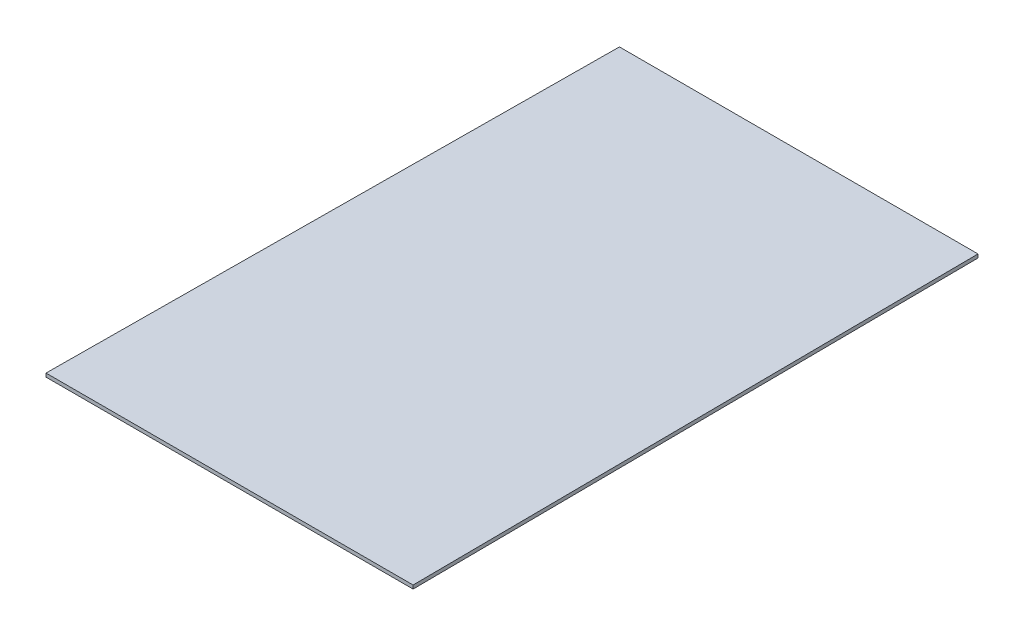
ISO-10303-21;
HEADER;
FILE_DESCRIPTION(('STEP AP214'),'2;1');
FILE_NAME('part.step','',(''),(''),'','','');
FILE_SCHEMA(('AUTOMOTIVE_DESIGN { 1 0 10303 214 1 1 1 1 }'));
ENDSEC;
DATA;
#1=APPLICATION_CONTEXT('core data for automotive mechanical design processes');
#2=APPLICATION_PROTOCOL_DEFINITION('international standard','automotive_design',2000,#1);
#3=PRODUCT_CONTEXT('',#1,'mechanical');
#4=PRODUCT('Part','Part','',(#3));
#5=PRODUCT_RELATED_PRODUCT_CATEGORY('part','',(#4));
#6=PRODUCT_DEFINITION_FORMATION('','',#4);
#7=PRODUCT_DEFINITION_CONTEXT('part definition',#1,'design');
#8=PRODUCT_DEFINITION('design','',#6,#7);
#9=PRODUCT_DEFINITION_SHAPE('','',#8);
#10=(LENGTH_UNIT() NAMED_UNIT(*) SI_UNIT(.MILLI.,.METRE.));
#11=(NAMED_UNIT(*) PLANE_ANGLE_UNIT() SI_UNIT($,.RADIAN.));
#12=(NAMED_UNIT(*) SI_UNIT($,.STERADIAN.) SOLID_ANGLE_UNIT());
#13=UNCERTAINTY_MEASURE_WITH_UNIT(LENGTH_MEASURE(1.E-05),#10,'distance_accuracy_value','');
#14=(GEOMETRIC_REPRESENTATION_CONTEXT(3) GLOBAL_UNCERTAINTY_ASSIGNED_CONTEXT((#13)) GLOBAL_UNIT_ASSIGNED_CONTEXT((#10,
#11,#12)) REPRESENTATION_CONTEXT('',''));
#15=CARTESIAN_POINT('',(0.,0.,0.));
#16=DIRECTION('',(0.,0.,1.));
#17=DIRECTION('',(1.,0.,0.));
#18=AXIS2_PLACEMENT_3D('',#15,#16,#17);
#19=CARTESIAN_POINT('',(-160.02,3.175,-508.));
#20=DIRECTION('',(0.999971876186468,0.,0.00749978907139852));
#21=DIRECTION('',(0.00749978907139852,0.,-0.999971876186468));
#22=AXIS2_PLACEMENT_3D('',#19,#20,#21);
#23=PLANE('',#22);
#24=DIRECTION('',(-0.00749978907139852,0.,0.999971876186468));
#25=VECTOR('',#24,1.);
#26=CARTESIAN_POINT('',(-160.02,0.,-508.));
#27=LINE('',#26,#25);
#28=CARTESIAN_POINT('',(-160.02,0.,-508.));
#29=VERTEX_POINT('',#28);
#30=CARTESIAN_POINT('',(-163.83,0.,0.));
#31=VERTEX_POINT('',#30);
#32=EDGE_CURVE('E102',#29,#31,#27,.T.);
#33=ORIENTED_EDGE('',*,*,#32,.T.);
#34=DIRECTION('',(0.,-1.,0.));
#35=VECTOR('',#34,1.);
#36=CARTESIAN_POINT('',(-163.83,3.175,0.));
#37=LINE('',#36,#35);
#38=CARTESIAN_POINT('',(-163.83,3.175,0.));
#39=VERTEX_POINT('',#38);
#40=EDGE_CURVE('E11',#39,#31,#37,.T.);
#41=ORIENTED_EDGE('',*,*,#40,.F.);
#42=DIRECTION('',(-0.00749978907139852,0.,0.999971876186468));
#43=VECTOR('',#42,1.);
#44=CARTESIAN_POINT('',(-160.02,3.175,-508.));
#45=LINE('',#44,#43);
#46=CARTESIAN_POINT('',(-160.02,3.175,-508.));
#47=VERTEX_POINT('',#46);
#48=EDGE_CURVE('E90',#47,#39,#45,.T.);
#49=ORIENTED_EDGE('',*,*,#48,.F.);
#50=DIRECTION('',(0.,-1.,0.));
#51=VECTOR('',#50,1.);
#52=CARTESIAN_POINT('',(-160.02,3.175,-508.));
#53=LINE('',#52,#51);
#54=EDGE_CURVE('E98',#47,#29,#53,.T.);
#55=ORIENTED_EDGE('',*,*,#54,.T.);
#56=EDGE_LOOP('',(#33,#41,#49,#55));
#57=FACE_BOUND('',#56,.T.);
#58=ADVANCED_FACE('F39',(#57),#23,.F.);
#59=CARTESIAN_POINT('',(-163.83,3.175,0.));
#60=DIRECTION('',(0.,0.,-1.));
#61=DIRECTION('',(-1.,0.,0.));
#62=AXIS2_PLACEMENT_3D('',#59,#60,#61);
#63=PLANE('',#62);
#64=DIRECTION('',(1.,0.,0.));
#65=VECTOR('',#64,1.);
#66=CARTESIAN_POINT('',(-163.83,0.,0.));
#67=LINE('',#66,#65);
#68=CARTESIAN_POINT('',(163.83,0.,0.));
#69=VERTEX_POINT('',#68);
#70=EDGE_CURVE('E94',#31,#69,#67,.T.);
#71=ORIENTED_EDGE('',*,*,#70,.T.);
#72=DIRECTION('',(0.,-1.,0.));
#73=VECTOR('',#72,1.);
#74=CARTESIAN_POINT('',(163.83,3.175,0.));
#75=LINE('',#74,#73);
#76=CARTESIAN_POINT('',(163.83,3.175,0.));
#77=VERTEX_POINT('',#76);
#78=EDGE_CURVE('E47',#77,#69,#75,.T.);
#79=ORIENTED_EDGE('',*,*,#78,.F.);
#80=DIRECTION('',(1.,0.,0.));
#81=VECTOR('',#80,1.);
#82=CARTESIAN_POINT('',(-163.83,3.175,0.));
#83=LINE('',#82,#81);
#84=EDGE_CURVE('E85',#39,#77,#83,.T.);
#85=ORIENTED_EDGE('',*,*,#84,.F.);
#86=ORIENTED_EDGE('',*,*,#40,.T.);
#87=EDGE_LOOP('',(#71,#79,#85,#86));
#88=FACE_BOUND('',#87,.T.);
#89=ADVANCED_FACE('F93',(#88),#63,.F.);
#90=CARTESIAN_POINT('',(160.02,3.175,-508.));
#91=DIRECTION('',(-0.999971876186468,0.,0.00749978907139852));
#92=DIRECTION('',(0.00749978907139852,0.,0.999971876186468));
#93=AXIS2_PLACEMENT_3D('',#90,#91,#92);
#94=PLANE('',#93);
#95=DIRECTION('',(-0.00749978907139852,0.,-0.999971876186468));
#96=VECTOR('',#95,1.);
#97=CARTESIAN_POINT('',(160.02,0.,-508.));
#98=LINE('',#97,#96);
#99=CARTESIAN_POINT('',(160.02,0.,-508.));
#100=VERTEX_POINT('',#99);
#101=EDGE_CURVE('E72',#69,#100,#98,.T.);
#102=ORIENTED_EDGE('',*,*,#101,.T.);
#103=DIRECTION('',(0.,-1.,0.));
#104=VECTOR('',#103,1.);
#105=CARTESIAN_POINT('',(160.02,3.175,-508.));
#106=LINE('',#105,#104);
#107=CARTESIAN_POINT('',(160.02,3.175,-508.));
#108=VERTEX_POINT('',#107);
#109=EDGE_CURVE('E95',#108,#100,#106,.T.);
#110=ORIENTED_EDGE('',*,*,#109,.F.);
#111=DIRECTION('',(-0.00749978907139852,0.,-0.999971876186468));
#112=VECTOR('',#111,1.);
#113=CARTESIAN_POINT('',(160.02,3.175,-508.));
#114=LINE('',#113,#112);
#115=EDGE_CURVE('E88',#77,#108,#114,.T.);
#116=ORIENTED_EDGE('',*,*,#115,.F.);
#117=ORIENTED_EDGE('',*,*,#78,.T.);
#118=EDGE_LOOP('',(#102,#110,#116,#117));
#119=FACE_BOUND('',#118,.T.);
#120=ADVANCED_FACE('F96',(#119),#94,.F.);
#121=CARTESIAN_POINT('',(-160.02,3.175,-508.));
#122=DIRECTION('',(0.,0.,1.));
#123=DIRECTION('',(1.,0.,0.));
#124=AXIS2_PLACEMENT_3D('',#121,#122,#123);
#125=PLANE('',#124);
#126=DIRECTION('',(-1.,0.,0.));
#127=VECTOR('',#126,1.);
#128=CARTESIAN_POINT('',(-160.02,0.,-508.));
#129=LINE('',#128,#127);
#130=EDGE_CURVE('E78',#100,#29,#129,.T.);
#131=ORIENTED_EDGE('',*,*,#130,.T.);
#132=ORIENTED_EDGE('',*,*,#54,.F.);
#133=DIRECTION('',(-1.,0.,0.));
#134=VECTOR('',#133,1.);
#135=CARTESIAN_POINT('',(-160.02,3.175,-508.));
#136=LINE('',#135,#134);
#137=EDGE_CURVE('E55',#108,#47,#136,.T.);
#138=ORIENTED_EDGE('',*,*,#137,.F.);
#139=ORIENTED_EDGE('',*,*,#109,.T.);
#140=EDGE_LOOP('',(#131,#132,#138,#139));
#141=FACE_BOUND('',#140,.T.);
#142=ADVANCED_FACE('F109',(#141),#125,.F.);
#143=CARTESIAN_POINT('',(0.,3.175,0.));
#144=DIRECTION('',(0.,1.,0.));
#145=DIRECTION('',(0.,0.,1.));
#146=AXIS2_PLACEMENT_3D('',#143,#144,#145);
#147=PLANE('',#146);
#148=ORIENTED_EDGE('',*,*,#48,.T.);
#149=ORIENTED_EDGE('',*,*,#84,.T.);
#150=ORIENTED_EDGE('',*,*,#115,.T.);
#151=ORIENTED_EDGE('',*,*,#137,.T.);
#152=EDGE_LOOP('',(#148,#149,#150,#151));
#153=FACE_BOUND('',#152,.T.);
#154=ADVANCED_FACE('F86',(#153),#147,.T.);
#155=CARTESIAN_POINT('',(0.,0.,0.));
#156=DIRECTION('',(0.,1.,0.));
#157=DIRECTION('',(0.,0.,1.));
#158=AXIS2_PLACEMENT_3D('',#155,#156,#157);
#159=PLANE('',#158);
#160=ORIENTED_EDGE('',*,*,#32,.F.);
#161=ORIENTED_EDGE('',*,*,#130,.F.);
#162=ORIENTED_EDGE('',*,*,#101,.F.);
#163=ORIENTED_EDGE('',*,*,#70,.F.);
#164=EDGE_LOOP('',(#160,#161,#162,#163));
#165=FACE_BOUND('',#164,.T.);
#166=ADVANCED_FACE('F112',(#165),#159,.F.);
#167=CLOSED_SHELL('',(#58,#89,#120,#142,#154,#166));
#168=MANIFOLD_SOLID_BREP('B2',#167);
#169=ADVANCED_BREP_SHAPE_REPRESENTATION('',(#18,#168),#14);
#170=SHAPE_DEFINITION_REPRESENTATION(#9,#169);
ENDSEC;
END-ISO-10303-21;
